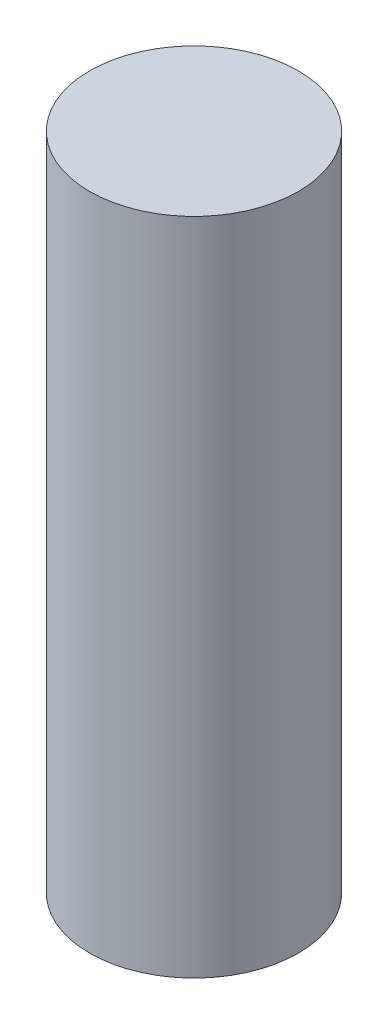
ISO-10303-21;
HEADER;
FILE_DESCRIPTION(('STEP AP214'),'2;1');
FILE_NAME('part.step','',(''),(''),'','','');
FILE_SCHEMA(('AUTOMOTIVE_DESIGN { 1 0 10303 214 1 1 1 1 }'));
ENDSEC;
DATA;
#1=APPLICATION_CONTEXT('core data for automotive mechanical design processes');
#2=APPLICATION_PROTOCOL_DEFINITION('international standard','automotive_design',2000,#1);
#3=PRODUCT_CONTEXT('',#1,'mechanical');
#4=PRODUCT('Part','Part','',(#3));
#5=PRODUCT_RELATED_PRODUCT_CATEGORY('part','',(#4));
#6=PRODUCT_DEFINITION_FORMATION('','',#4);
#7=PRODUCT_DEFINITION_CONTEXT('part definition',#1,'design');
#8=PRODUCT_DEFINITION('design','',#6,#7);
#9=PRODUCT_DEFINITION_SHAPE('','',#8);
#10=(LENGTH_UNIT() NAMED_UNIT(*) SI_UNIT(.MILLI.,.METRE.));
#11=(NAMED_UNIT(*) PLANE_ANGLE_UNIT() SI_UNIT($,.RADIAN.));
#12=(NAMED_UNIT(*) SI_UNIT($,.STERADIAN.) SOLID_ANGLE_UNIT());
#13=UNCERTAINTY_MEASURE_WITH_UNIT(LENGTH_MEASURE(1.E-05),#10,'distance_accuracy_value','');
#14=(GEOMETRIC_REPRESENTATION_CONTEXT(3) GLOBAL_UNCERTAINTY_ASSIGNED_CONTEXT((#13)) GLOBAL_UNIT_ASSIGNED_CONTEXT((#10,
#11,#12)) REPRESENTATION_CONTEXT('',''));
#15=CARTESIAN_POINT('',(0.,0.,0.));
#16=DIRECTION('',(0.,0.,1.));
#17=DIRECTION('',(1.,0.,0.));
#18=AXIS2_PLACEMENT_3D('',#15,#16,#17);
#19=CARTESIAN_POINT('',(0.,9.,0.));
#20=DIRECTION('',(0.,-1.,0.));
#21=DIRECTION('',(0.,0.,-1.));
#22=AXIS2_PLACEMENT_3D('',#19,#20,#21);
#23=CYLINDRICAL_SURFACE('',#22,1.425);
#24=CARTESIAN_POINT('',(0.,9.,0.));
#25=DIRECTION('',(0.,1.,0.));
#26=DIRECTION('',(0.,0.,1.));
#27=AXIS2_PLACEMENT_3D('',#24,#25,#26);
#28=CIRCLE('',#27,1.425);
#29=CARTESIAN_POINT('',(0.,9.,1.425));
#30=VERTEX_POINT('',#29);
#31=EDGE_CURVE('E10',#30,#30,#28,.T.);
#32=ORIENTED_EDGE('',*,*,#31,.F.);
#33=EDGE_LOOP('',(#32));
#34=FACE_BOUND('',#33,.T.);
#35=CARTESIAN_POINT('',(0.,0.,0.));
#36=DIRECTION('',(0.,1.,0.));
#37=DIRECTION('',(0.,0.,1.));
#38=AXIS2_PLACEMENT_3D('',#35,#36,#37);
#39=CIRCLE('',#38,1.425);
#40=CARTESIAN_POINT('',(0.,0.,1.425));
#41=VERTEX_POINT('',#40);
#42=EDGE_CURVE('E40',#41,#41,#39,.T.);
#43=ORIENTED_EDGE('',*,*,#42,.T.);
#44=EDGE_LOOP('',(#43));
#45=FACE_BOUND('',#44,.T.);
#46=ADVANCED_FACE('F37',(#34,#45),#23,.T.);
#47=CARTESIAN_POINT('',(0.,9.,0.));
#48=DIRECTION('',(0.,1.,0.));
#49=DIRECTION('',(0.,0.,1.));
#50=AXIS2_PLACEMENT_3D('',#47,#48,#49);
#51=PLANE('',#50);
#52=ORIENTED_EDGE('',*,*,#31,.T.);
#53=EDGE_LOOP('',(#52));
#54=FACE_BOUND('',#53,.T.);
#55=ADVANCED_FACE('F54',(#54),#51,.T.);
#56=CARTESIAN_POINT('',(0.,0.,0.));
#57=DIRECTION('',(0.,1.,0.));
#58=DIRECTION('',(0.,0.,1.));
#59=AXIS2_PLACEMENT_3D('',#56,#57,#58);
#60=PLANE('',#59);
#61=ORIENTED_EDGE('',*,*,#42,.F.);
#62=EDGE_LOOP('',(#61));
#63=FACE_BOUND('',#62,.T.);
#64=ADVANCED_FACE('F52',(#63),#60,.F.);
#65=CLOSED_SHELL('',(#46,#55,#64));
#66=MANIFOLD_SOLID_BREP('B2',#65);
#67=ADVANCED_BREP_SHAPE_REPRESENTATION('',(#18,#66),#14);
#68=SHAPE_DEFINITION_REPRESENTATION(#9,#67);
ENDSEC;
END-ISO-10303-21;
